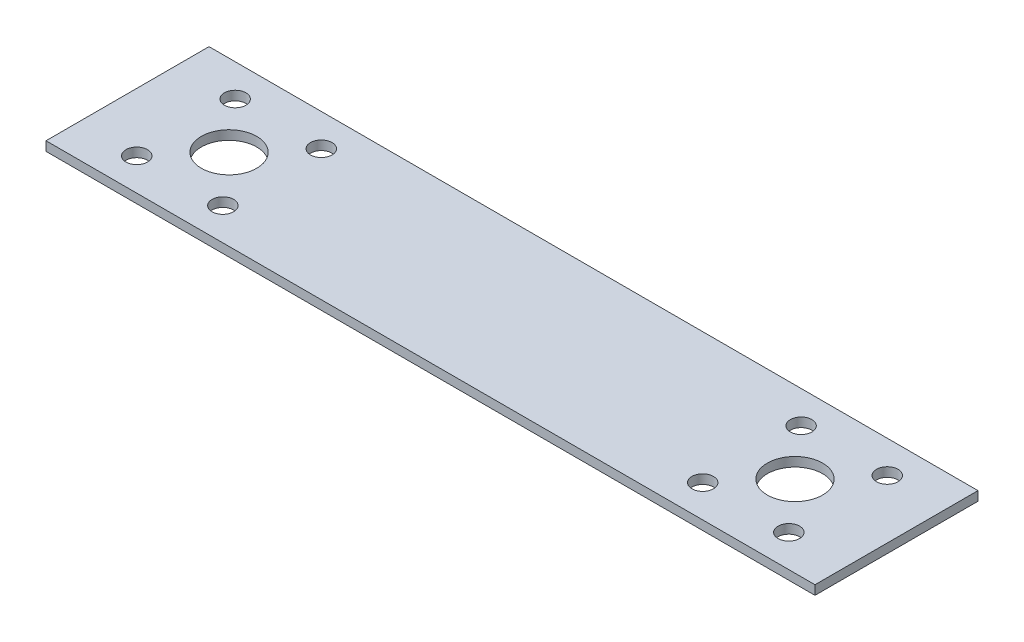
ISO-10303-21;
HEADER;
FILE_DESCRIPTION(('STEP AP214'),'2;1');
FILE_NAME('part.step','',(''),(''),'','','');
FILE_SCHEMA(('AUTOMOTIVE_DESIGN { 1 0 10303 214 1 1 1 1 }'));
ENDSEC;
DATA;
#1=APPLICATION_CONTEXT('core data for automotive mechanical design processes');
#2=APPLICATION_PROTOCOL_DEFINITION('international standard','automotive_design',2000,#1);
#3=PRODUCT_CONTEXT('',#1,'mechanical');
#4=PRODUCT('Part','Part','',(#3));
#5=PRODUCT_RELATED_PRODUCT_CATEGORY('part','',(#4));
#6=PRODUCT_DEFINITION_FORMATION('','',#4);
#7=PRODUCT_DEFINITION_CONTEXT('part definition',#1,'design');
#8=PRODUCT_DEFINITION('design','',#6,#7);
#9=PRODUCT_DEFINITION_SHAPE('','',#8);
#10=(LENGTH_UNIT() NAMED_UNIT(*) SI_UNIT(.MILLI.,.METRE.));
#11=(NAMED_UNIT(*) PLANE_ANGLE_UNIT() SI_UNIT($,.RADIAN.));
#12=(NAMED_UNIT(*) SI_UNIT($,.STERADIAN.) SOLID_ANGLE_UNIT());
#13=UNCERTAINTY_MEASURE_WITH_UNIT(LENGTH_MEASURE(1.E-05),#10,'distance_accuracy_value','');
#14=(GEOMETRIC_REPRESENTATION_CONTEXT(3) GLOBAL_UNCERTAINTY_ASSIGNED_CONTEXT((#13)) GLOBAL_UNIT_ASSIGNED_CONTEXT((#10,
#11,#12)) REPRESENTATION_CONTEXT('',''));
#15=CARTESIAN_POINT('',(0.,0.,0.));
#16=DIRECTION('',(0.,0.,1.));
#17=DIRECTION('',(1.,0.,0.));
#18=AXIS2_PLACEMENT_3D('',#15,#16,#17);
#19=CARTESIAN_POINT('',(0.,1.5,-24.4082974918942));
#20=DIRECTION('',(0.,0.,1.));
#21=DIRECTION('',(1.,0.,0.));
#22=AXIS2_PLACEMENT_3D('',#19,#20,#21);
#23=PLANE('',#22);
#24=DIRECTION('',(-1.,0.,0.));
#25=VECTOR('',#24,1.);
#26=CARTESIAN_POINT('',(0.,0.,-24.4082974918942));
#27=LINE('',#26,#25);
#28=CARTESIAN_POINT('',(61.8410162019103,0.,-24.4082974918942));
#29=VERTEX_POINT('',#28);
#30=CARTESIAN_POINT('',(-63.1589837980897,0.,-24.4082974918942));
#31=VERTEX_POINT('',#30);
#32=EDGE_CURVE('E154',#29,#31,#27,.T.);
#33=ORIENTED_EDGE('',*,*,#32,.F.);
#34=DIRECTION('',(0.,-1.,0.));
#35=VECTOR('',#34,1.);
#36=CARTESIAN_POINT('',(61.8410162019103,1.5,-24.4082974918942));
#37=LINE('',#36,#35);
#38=CARTESIAN_POINT('',(61.8410162019103,1.5,-24.4082974918942));
#39=VERTEX_POINT('',#38);
#40=EDGE_CURVE('E11',#39,#29,#37,.T.);
#41=ORIENTED_EDGE('',*,*,#40,.F.);
#42=DIRECTION('',(-1.,0.,0.));
#43=VECTOR('',#42,1.);
#44=CARTESIAN_POINT('',(0.,1.5,-24.4082974918942));
#45=LINE('',#44,#43);
#46=CARTESIAN_POINT('',(-63.1589837980897,1.5,-24.4082974918942));
#47=VERTEX_POINT('',#46);
#48=EDGE_CURVE('E95',#39,#47,#45,.T.);
#49=ORIENTED_EDGE('',*,*,#48,.T.);
#50=DIRECTION('',(0.,-1.,0.));
#51=VECTOR('',#50,1.);
#52=CARTESIAN_POINT('',(-63.1589837980897,1.5,-24.4082974918942));
#53=LINE('',#52,#51);
#54=EDGE_CURVE('E63',#47,#31,#53,.T.);
#55=ORIENTED_EDGE('',*,*,#54,.T.);
#56=EDGE_LOOP('',(#33,#41,#49,#55));
#57=FACE_BOUND('',#56,.T.);
#58=ADVANCED_FACE('F45',(#57),#23,.T.);
#59=CARTESIAN_POINT('',(61.8410162019103,1.5,0.));
#60=DIRECTION('',(-1.,0.,0.));
#61=DIRECTION('',(0.,0.,1.));
#62=AXIS2_PLACEMENT_3D('',#59,#60,#61);
#63=PLANE('',#62);
#64=DIRECTION('',(0.,0.,-1.));
#65=VECTOR('',#64,1.);
#66=CARTESIAN_POINT('',(61.8410162019103,0.,0.));
#67=LINE('',#66,#65);
#68=CARTESIAN_POINT('',(61.8410162019103,0.,-50.9082974918942));
#69=VERTEX_POINT('',#68);
#70=EDGE_CURVE('E102',#29,#69,#67,.T.);
#71=ORIENTED_EDGE('',*,*,#70,.T.);
#72=DIRECTION('',(0.,-1.,0.));
#73=VECTOR('',#72,1.);
#74=CARTESIAN_POINT('',(61.8410162019103,1.5,-50.9082974918942));
#75=LINE('',#74,#73);
#76=CARTESIAN_POINT('',(61.8410162019103,1.5,-50.9082974918942));
#77=VERTEX_POINT('',#76);
#78=EDGE_CURVE('E55',#77,#69,#75,.T.);
#79=ORIENTED_EDGE('',*,*,#78,.F.);
#80=DIRECTION('',(0.,0.,-1.));
#81=VECTOR('',#80,1.);
#82=CARTESIAN_POINT('',(61.8410162019103,1.5,0.));
#83=LINE('',#82,#81);
#84=EDGE_CURVE('E89',#39,#77,#83,.T.);
#85=ORIENTED_EDGE('',*,*,#84,.F.);
#86=ORIENTED_EDGE('',*,*,#40,.T.);
#87=EDGE_LOOP('',(#71,#79,#85,#86));
#88=FACE_BOUND('',#87,.T.);
#89=ADVANCED_FACE('F100',(#88),#63,.F.);
#90=CARTESIAN_POINT('',(0.,1.5,-50.9082974918942));
#91=DIRECTION('',(0.,0.,-1.));
#92=DIRECTION('',(-1.,0.,0.));
#93=AXIS2_PLACEMENT_3D('',#90,#91,#92);
#94=PLANE('',#93);
#95=DIRECTION('',(1.,0.,0.));
#96=VECTOR('',#95,1.);
#97=CARTESIAN_POINT('',(0.,0.,-50.9082974918942));
#98=LINE('',#97,#96);
#99=CARTESIAN_POINT('',(-63.1589837980897,0.,-50.9082974918942));
#100=VERTEX_POINT('',#99);
#101=EDGE_CURVE('E159',#100,#69,#98,.T.);
#102=ORIENTED_EDGE('',*,*,#101,.F.);
#103=DIRECTION('',(0.,-1.,0.));
#104=VECTOR('',#103,1.);
#105=CARTESIAN_POINT('',(-63.1589837980897,1.5,-50.9082974918942));
#106=LINE('',#105,#104);
#107=CARTESIAN_POINT('',(-63.1589837980897,1.5,-50.9082974918942));
#108=VERTEX_POINT('',#107);
#109=EDGE_CURVE('E76',#108,#100,#106,.T.);
#110=ORIENTED_EDGE('',*,*,#109,.F.);
#111=DIRECTION('',(1.,0.,0.));
#112=VECTOR('',#111,1.);
#113=CARTESIAN_POINT('',(0.,1.5,-50.9082974918942));
#114=LINE('',#113,#112);
#115=EDGE_CURVE('E94',#108,#77,#114,.T.);
#116=ORIENTED_EDGE('',*,*,#115,.T.);
#117=ORIENTED_EDGE('',*,*,#78,.T.);
#118=EDGE_LOOP('',(#102,#110,#116,#117));
#119=FACE_BOUND('',#118,.T.);
#120=ADVANCED_FACE('F106',(#119),#94,.T.);
#121=CARTESIAN_POINT('',(-46.6589837980897,1.5,-37.6582974918942));
#122=DIRECTION('',(0.,-1.,0.));
#123=DIRECTION('',(0.,0.,-1.));
#124=AXIS2_PLACEMENT_3D('',#121,#122,#123);
#125=CYLINDRICAL_SURFACE('',#124,4.5);
#126=CARTESIAN_POINT('',(-46.6589837980897,1.5,-37.6582974918942));
#127=DIRECTION('',(0.,1.,0.));
#128=DIRECTION('',(0.,0.,1.));
#129=AXIS2_PLACEMENT_3D('',#126,#127,#128);
#130=CIRCLE('',#129,4.5);
#131=CARTESIAN_POINT('',(-46.6589837980897,1.5,-33.1582974918942));
#132=VERTEX_POINT('',#131);
#133=EDGE_CURVE('E209',#132,#132,#130,.T.);
#134=ORIENTED_EDGE('',*,*,#133,.T.);
#135=EDGE_LOOP('',(#134));
#136=FACE_BOUND('',#135,.T.);
#137=CARTESIAN_POINT('',(-46.6589837980897,0.,-37.6582974918942));
#138=DIRECTION('',(0.,1.,0.));
#139=DIRECTION('',(0.,0.,1.));
#140=AXIS2_PLACEMENT_3D('',#137,#138,#139);
#141=CIRCLE('',#140,4.5);
#142=CARTESIAN_POINT('',(-46.6589837980897,0.,-33.1582974918942));
#143=VERTEX_POINT('',#142);
#144=EDGE_CURVE('E150',#143,#143,#141,.T.);
#145=ORIENTED_EDGE('',*,*,#144,.F.);
#146=EDGE_LOOP('',(#145));
#147=FACE_BOUND('',#146,.T.);
#148=ADVANCED_FACE('F233',(#136,#147),#125,.F.);
#149=CARTESIAN_POINT('',(-39.6589837980897,1.5,-45.6582974918942));
#150=DIRECTION('',(0.,-1.,0.));
#151=DIRECTION('',(0.,0.,-1.));
#152=AXIS2_PLACEMENT_3D('',#149,#150,#151);
#153=CYLINDRICAL_SURFACE('',#152,1.75);
#154=CARTESIAN_POINT('',(-39.6589837980897,1.5,-45.6582974918942));
#155=DIRECTION('',(0.,1.,0.));
#156=DIRECTION('',(0.,0.,1.));
#157=AXIS2_PLACEMENT_3D('',#154,#155,#156);
#158=CIRCLE('',#157,1.75);
#159=CARTESIAN_POINT('',(-39.6589837980897,1.5,-43.9082974918942));
#160=VERTEX_POINT('',#159);
#161=EDGE_CURVE('E205',#160,#160,#158,.T.);
#162=ORIENTED_EDGE('',*,*,#161,.T.);
#163=EDGE_LOOP('',(#162));
#164=FACE_BOUND('',#163,.T.);
#165=CARTESIAN_POINT('',(-39.6589837980897,0.,-45.6582974918942));
#166=DIRECTION('',(0.,1.,0.));
#167=DIRECTION('',(0.,0.,1.));
#168=AXIS2_PLACEMENT_3D('',#165,#166,#167);
#169=CIRCLE('',#168,1.75);
#170=CARTESIAN_POINT('',(-39.6589837980897,0.,-43.9082974918942));
#171=VERTEX_POINT('',#170);
#172=EDGE_CURVE('E146',#171,#171,#169,.T.);
#173=ORIENTED_EDGE('',*,*,#172,.F.);
#174=EDGE_LOOP('',(#173));
#175=FACE_BOUND('',#174,.T.);
#176=ADVANCED_FACE('F236',(#164,#175),#153,.F.);
#177=CARTESIAN_POINT('',(-39.6589837980897,1.5,-29.6582974918942));
#178=DIRECTION('',(0.,-1.,0.));
#179=DIRECTION('',(0.,0.,-1.));
#180=AXIS2_PLACEMENT_3D('',#177,#178,#179);
#181=CYLINDRICAL_SURFACE('',#180,1.75);
#182=CARTESIAN_POINT('',(-39.6589837980897,1.5,-29.6582974918942));
#183=DIRECTION('',(0.,1.,0.));
#184=DIRECTION('',(0.,0.,1.));
#185=AXIS2_PLACEMENT_3D('',#182,#183,#184);
#186=CIRCLE('',#185,1.75);
#187=CARTESIAN_POINT('',(-39.6589837980897,1.5,-27.9082974918942));
#188=VERTEX_POINT('',#187);
#189=EDGE_CURVE('E201',#188,#188,#186,.T.);
#190=ORIENTED_EDGE('',*,*,#189,.T.);
#191=EDGE_LOOP('',(#190));
#192=FACE_BOUND('',#191,.T.);
#193=CARTESIAN_POINT('',(-39.6589837980897,0.,-29.6582974918942));
#194=DIRECTION('',(0.,1.,0.));
#195=DIRECTION('',(0.,0.,1.));
#196=AXIS2_PLACEMENT_3D('',#193,#194,#195);
#197=CIRCLE('',#196,1.75);
#198=CARTESIAN_POINT('',(-39.6589837980897,0.,-27.9082974918942));
#199=VERTEX_POINT('',#198);
#200=EDGE_CURVE('E142',#199,#199,#197,.T.);
#201=ORIENTED_EDGE('',*,*,#200,.F.);
#202=EDGE_LOOP('',(#201));
#203=FACE_BOUND('',#202,.T.);
#204=ADVANCED_FACE('F240',(#192,#203),#181,.F.);
#205=CARTESIAN_POINT('',(-53.6589837980897,1.5,-29.6582974918942));
#206=DIRECTION('',(0.,-1.,0.));
#207=DIRECTION('',(0.,0.,-1.));
#208=AXIS2_PLACEMENT_3D('',#205,#206,#207);
#209=CYLINDRICAL_SURFACE('',#208,1.75);
#210=CARTESIAN_POINT('',(-53.6589837980897,1.5,-29.6582974918942));
#211=DIRECTION('',(0.,1.,0.));
#212=DIRECTION('',(0.,0.,1.));
#213=AXIS2_PLACEMENT_3D('',#210,#211,#212);
#214=CIRCLE('',#213,1.75);
#215=CARTESIAN_POINT('',(-53.6589837980897,1.5,-27.9082974918942));
#216=VERTEX_POINT('',#215);
#217=EDGE_CURVE('E197',#216,#216,#214,.T.);
#218=ORIENTED_EDGE('',*,*,#217,.T.);
#219=EDGE_LOOP('',(#218));
#220=FACE_BOUND('',#219,.T.);
#221=CARTESIAN_POINT('',(-53.6589837980897,0.,-29.6582974918942));
#222=DIRECTION('',(0.,1.,0.));
#223=DIRECTION('',(0.,0.,1.));
#224=AXIS2_PLACEMENT_3D('',#221,#222,#223);
#225=CIRCLE('',#224,1.75);
#226=CARTESIAN_POINT('',(-53.6589837980897,0.,-27.9082974918942));
#227=VERTEX_POINT('',#226);
#228=EDGE_CURVE('E138',#227,#227,#225,.T.);
#229=ORIENTED_EDGE('',*,*,#228,.F.);
#230=EDGE_LOOP('',(#229));
#231=FACE_BOUND('',#230,.T.);
#232=ADVANCED_FACE('F244',(#220,#231),#209,.F.);
#233=CARTESIAN_POINT('',(-53.6589837980897,1.5,-45.6582974918942));
#234=DIRECTION('',(0.,-1.,0.));
#235=DIRECTION('',(0.,0.,-1.));
#236=AXIS2_PLACEMENT_3D('',#233,#234,#235);
#237=CYLINDRICAL_SURFACE('',#236,1.75);
#238=CARTESIAN_POINT('',(-53.6589837980897,1.5,-45.6582974918942));
#239=DIRECTION('',(0.,1.,0.));
#240=DIRECTION('',(0.,0.,1.));
#241=AXIS2_PLACEMENT_3D('',#238,#239,#240);
#242=CIRCLE('',#241,1.75);
#243=CARTESIAN_POINT('',(-53.6589837980897,1.5,-43.9082974918942));
#244=VERTEX_POINT('',#243);
#245=EDGE_CURVE('E193',#244,#244,#242,.T.);
#246=ORIENTED_EDGE('',*,*,#245,.T.);
#247=EDGE_LOOP('',(#246));
#248=FACE_BOUND('',#247,.T.);
#249=CARTESIAN_POINT('',(-53.6589837980897,0.,-45.6582974918942));
#250=DIRECTION('',(0.,1.,0.));
#251=DIRECTION('',(0.,0.,1.));
#252=AXIS2_PLACEMENT_3D('',#249,#250,#251);
#253=CIRCLE('',#252,1.75);
#254=CARTESIAN_POINT('',(-53.6589837980897,0.,-43.9082974918942));
#255=VERTEX_POINT('',#254);
#256=EDGE_CURVE('E134',#255,#255,#253,.T.);
#257=ORIENTED_EDGE('',*,*,#256,.F.);
#258=EDGE_LOOP('',(#257));
#259=FACE_BOUND('',#258,.T.);
#260=ADVANCED_FACE('F248',(#248,#259),#237,.F.);
#261=CARTESIAN_POINT('',(45.3410162019103,1.5,-37.6582974918942));
#262=DIRECTION('',(0.,-1.,0.));
#263=DIRECTION('',(0.,0.,-1.));
#264=AXIS2_PLACEMENT_3D('',#261,#262,#263);
#265=CYLINDRICAL_SURFACE('',#264,4.5);
#266=CARTESIAN_POINT('',(45.3410162019103,1.5,-37.6582974918942));
#267=DIRECTION('',(0.,1.,0.));
#268=DIRECTION('',(0.,0.,1.));
#269=AXIS2_PLACEMENT_3D('',#266,#267,#268);
#270=CIRCLE('',#269,4.5);
#271=CARTESIAN_POINT('',(45.3410162019103,1.5,-33.1582974918942));
#272=VERTEX_POINT('',#271);
#273=EDGE_CURVE('E189',#272,#272,#270,.T.);
#274=ORIENTED_EDGE('',*,*,#273,.T.);
#275=EDGE_LOOP('',(#274));
#276=FACE_BOUND('',#275,.T.);
#277=CARTESIAN_POINT('',(45.3410162019103,0.,-37.6582974918942));
#278=DIRECTION('',(0.,1.,0.));
#279=DIRECTION('',(0.,0.,1.));
#280=AXIS2_PLACEMENT_3D('',#277,#278,#279);
#281=CIRCLE('',#280,4.5);
#282=CARTESIAN_POINT('',(45.3410162019103,0.,-33.1582974918942));
#283=VERTEX_POINT('',#282);
#284=EDGE_CURVE('E130',#283,#283,#281,.T.);
#285=ORIENTED_EDGE('',*,*,#284,.F.);
#286=EDGE_LOOP('',(#285));
#287=FACE_BOUND('',#286,.T.);
#288=ADVANCED_FACE('F252',(#276,#287),#265,.F.);
#289=CARTESIAN_POINT('',(52.3410162019103,1.5,-45.6582974918942));
#290=DIRECTION('',(0.,-1.,0.));
#291=DIRECTION('',(0.,0.,-1.));
#292=AXIS2_PLACEMENT_3D('',#289,#290,#291);
#293=CYLINDRICAL_SURFACE('',#292,1.75);
#294=CARTESIAN_POINT('',(52.3410162019103,1.5,-45.6582974918942));
#295=DIRECTION('',(0.,1.,0.));
#296=DIRECTION('',(0.,0.,1.));
#297=AXIS2_PLACEMENT_3D('',#294,#295,#296);
#298=CIRCLE('',#297,1.75);
#299=CARTESIAN_POINT('',(52.3410162019103,1.5,-43.9082974918942));
#300=VERTEX_POINT('',#299);
#301=EDGE_CURVE('E185',#300,#300,#298,.T.);
#302=ORIENTED_EDGE('',*,*,#301,.T.);
#303=EDGE_LOOP('',(#302));
#304=FACE_BOUND('',#303,.T.);
#305=CARTESIAN_POINT('',(52.3410162019103,0.,-45.6582974918942));
#306=DIRECTION('',(0.,1.,0.));
#307=DIRECTION('',(0.,0.,1.));
#308=AXIS2_PLACEMENT_3D('',#305,#306,#307);
#309=CIRCLE('',#308,1.75);
#310=CARTESIAN_POINT('',(52.3410162019103,0.,-43.9082974918942));
#311=VERTEX_POINT('',#310);
#312=EDGE_CURVE('E126',#311,#311,#309,.T.);
#313=ORIENTED_EDGE('',*,*,#312,.F.);
#314=EDGE_LOOP('',(#313));
#315=FACE_BOUND('',#314,.T.);
#316=ADVANCED_FACE('F256',(#304,#315),#293,.F.);
#317=CARTESIAN_POINT('',(52.3410162019103,1.5,-29.6582974918942));
#318=DIRECTION('',(0.,-1.,0.));
#319=DIRECTION('',(0.,0.,-1.));
#320=AXIS2_PLACEMENT_3D('',#317,#318,#319);
#321=CYLINDRICAL_SURFACE('',#320,1.75);
#322=CARTESIAN_POINT('',(52.3410162019103,1.5,-29.6582974918942));
#323=DIRECTION('',(0.,1.,0.));
#324=DIRECTION('',(0.,0.,1.));
#325=AXIS2_PLACEMENT_3D('',#322,#323,#324);
#326=CIRCLE('',#325,1.75);
#327=CARTESIAN_POINT('',(52.3410162019103,1.5,-27.9082974918942));
#328=VERTEX_POINT('',#327);
#329=EDGE_CURVE('E179',#328,#328,#326,.T.);
#330=ORIENTED_EDGE('',*,*,#329,.T.);
#331=EDGE_LOOP('',(#330));
#332=FACE_BOUND('',#331,.T.);
#333=CARTESIAN_POINT('',(52.3410162019103,0.,-29.6582974918942));
#334=DIRECTION('',(0.,1.,0.));
#335=DIRECTION('',(0.,0.,1.));
#336=AXIS2_PLACEMENT_3D('',#333,#334,#335);
#337=CIRCLE('',#336,1.75);
#338=CARTESIAN_POINT('',(52.3410162019103,0.,-27.9082974918942));
#339=VERTEX_POINT('',#338);
#340=EDGE_CURVE('E122',#339,#339,#337,.T.);
#341=ORIENTED_EDGE('',*,*,#340,.F.);
#342=EDGE_LOOP('',(#341));
#343=FACE_BOUND('',#342,.T.);
#344=ADVANCED_FACE('F260',(#332,#343),#321,.F.);
#345=CARTESIAN_POINT('',(38.3410162019103,1.5,-45.6582974918942));
#346=DIRECTION('',(0.,-1.,0.));
#347=DIRECTION('',(0.,0.,-1.));
#348=AXIS2_PLACEMENT_3D('',#345,#346,#347);
#349=CYLINDRICAL_SURFACE('',#348,1.75);
#350=CARTESIAN_POINT('',(38.3410162019103,1.5,-45.6582974918942));
#351=DIRECTION('',(0.,1.,0.));
#352=DIRECTION('',(0.,0.,1.));
#353=AXIS2_PLACEMENT_3D('',#350,#351,#352);
#354=CIRCLE('',#353,1.75);
#355=CARTESIAN_POINT('',(38.3410162019103,1.5,-43.9082974918942));
#356=VERTEX_POINT('',#355);
#357=EDGE_CURVE('E173',#356,#356,#354,.T.);
#358=ORIENTED_EDGE('',*,*,#357,.T.);
#359=EDGE_LOOP('',(#358));
#360=FACE_BOUND('',#359,.T.);
#361=CARTESIAN_POINT('',(38.3410162019103,0.,-45.6582974918942));
#362=DIRECTION('',(0.,1.,0.));
#363=DIRECTION('',(0.,0.,1.));
#364=AXIS2_PLACEMENT_3D('',#361,#362,#363);
#365=CIRCLE('',#364,1.75);
#366=CARTESIAN_POINT('',(38.3410162019103,0.,-43.9082974918942));
#367=VERTEX_POINT('',#366);
#368=EDGE_CURVE('E118',#367,#367,#365,.T.);
#369=ORIENTED_EDGE('',*,*,#368,.F.);
#370=EDGE_LOOP('',(#369));
#371=FACE_BOUND('',#370,.T.);
#372=ADVANCED_FACE('F223',(#360,#371),#349,.F.);
#373=CARTESIAN_POINT('',(38.3410162019103,1.5,-29.6582974918942));
#374=DIRECTION('',(0.,-1.,0.));
#375=DIRECTION('',(0.,0.,-1.));
#376=AXIS2_PLACEMENT_3D('',#373,#374,#375);
#377=CYLINDRICAL_SURFACE('',#376,1.75);
#378=CARTESIAN_POINT('',(38.3410162019103,1.5,-29.6582974918942));
#379=DIRECTION('',(0.,1.,0.));
#380=DIRECTION('',(0.,0.,1.));
#381=AXIS2_PLACEMENT_3D('',#378,#379,#380);
#382=CIRCLE('',#381,1.75);
#383=CARTESIAN_POINT('',(38.3410162019103,1.5,-27.9082974918942));
#384=VERTEX_POINT('',#383);
#385=EDGE_CURVE('E166',#384,#384,#382,.T.);
#386=ORIENTED_EDGE('',*,*,#385,.T.);
#387=EDGE_LOOP('',(#386));
#388=FACE_BOUND('',#387,.T.);
#389=CARTESIAN_POINT('',(38.3410162019103,0.,-29.6582974918942));
#390=DIRECTION('',(0.,1.,0.));
#391=DIRECTION('',(0.,0.,1.));
#392=AXIS2_PLACEMENT_3D('',#389,#390,#391);
#393=CIRCLE('',#392,1.75);
#394=CARTESIAN_POINT('',(38.3410162019103,0.,-27.9082974918942));
#395=VERTEX_POINT('',#394);
#396=EDGE_CURVE('E114',#395,#395,#393,.T.);
#397=ORIENTED_EDGE('',*,*,#396,.F.);
#398=EDGE_LOOP('',(#397));
#399=FACE_BOUND('',#398,.T.);
#400=ADVANCED_FACE('F47',(#388,#399),#377,.F.);
#401=CARTESIAN_POINT('',(-63.1589837980897,1.5,0.));
#402=DIRECTION('',(-1.,0.,0.));
#403=DIRECTION('',(0.,0.,1.));
#404=AXIS2_PLACEMENT_3D('',#401,#402,#403);
#405=PLANE('',#404);
#406=DIRECTION('',(0.,0.,-1.));
#407=VECTOR('',#406,1.);
#408=CARTESIAN_POINT('',(-63.1589837980897,0.,0.));
#409=LINE('',#408,#407);
#410=EDGE_CURVE('E162',#31,#100,#409,.T.);
#411=ORIENTED_EDGE('',*,*,#410,.F.);
#412=ORIENTED_EDGE('',*,*,#54,.F.);
#413=DIRECTION('',(0.,0.,-1.));
#414=VECTOR('',#413,1.);
#415=CARTESIAN_POINT('',(-63.1589837980897,1.5,0.));
#416=LINE('',#415,#414);
#417=EDGE_CURVE('E108',#47,#108,#416,.T.);
#418=ORIENTED_EDGE('',*,*,#417,.T.);
#419=ORIENTED_EDGE('',*,*,#109,.T.);
#420=EDGE_LOOP('',(#411,#412,#418,#419));
#421=FACE_BOUND('',#420,.T.);
#422=ADVANCED_FACE('F213',(#421),#405,.T.);
#423=CARTESIAN_POINT('',(0.,1.5,0.));
#424=DIRECTION('',(0.,1.,0.));
#425=DIRECTION('',(0.,0.,1.));
#426=AXIS2_PLACEMENT_3D('',#423,#424,#425);
#427=PLANE('',#426);
#428=ORIENTED_EDGE('',*,*,#385,.F.);
#429=EDGE_LOOP('',(#428));
#430=FACE_BOUND('',#429,.T.);
#431=ORIENTED_EDGE('',*,*,#357,.F.);
#432=EDGE_LOOP('',(#431));
#433=FACE_BOUND('',#432,.T.);
#434=ORIENTED_EDGE('',*,*,#329,.F.);
#435=EDGE_LOOP('',(#434));
#436=FACE_BOUND('',#435,.T.);
#437=ORIENTED_EDGE('',*,*,#301,.F.);
#438=EDGE_LOOP('',(#437));
#439=FACE_BOUND('',#438,.T.);
#440=ORIENTED_EDGE('',*,*,#273,.F.);
#441=EDGE_LOOP('',(#440));
#442=FACE_BOUND('',#441,.T.);
#443=ORIENTED_EDGE('',*,*,#245,.F.);
#444=EDGE_LOOP('',(#443));
#445=FACE_BOUND('',#444,.T.);
#446=ORIENTED_EDGE('',*,*,#217,.F.);
#447=EDGE_LOOP('',(#446));
#448=FACE_BOUND('',#447,.T.);
#449=ORIENTED_EDGE('',*,*,#189,.F.);
#450=EDGE_LOOP('',(#449));
#451=FACE_BOUND('',#450,.T.);
#452=ORIENTED_EDGE('',*,*,#161,.F.);
#453=EDGE_LOOP('',(#452));
#454=FACE_BOUND('',#453,.T.);
#455=ORIENTED_EDGE('',*,*,#133,.F.);
#456=EDGE_LOOP('',(#455));
#457=FACE_BOUND('',#456,.T.);
#458=ORIENTED_EDGE('',*,*,#48,.F.);
#459=ORIENTED_EDGE('',*,*,#84,.T.);
#460=ORIENTED_EDGE('',*,*,#115,.F.);
#461=ORIENTED_EDGE('',*,*,#417,.F.);
#462=EDGE_LOOP('',(#458,#459,#460,#461));
#463=FACE_BOUND('',#462,.T.);
#464=ADVANCED_FACE('F91',(#430,#433,#436,#439,#442,#445,#448,#451,#454,#457,#463),#427,.T.);
#465=CARTESIAN_POINT('',(0.,0.,0.));
#466=DIRECTION('',(0.,1.,0.));
#467=DIRECTION('',(0.,0.,1.));
#468=AXIS2_PLACEMENT_3D('',#465,#466,#467);
#469=PLANE('',#468);
#470=ORIENTED_EDGE('',*,*,#396,.T.);
#471=EDGE_LOOP('',(#470));
#472=FACE_BOUND('',#471,.T.);
#473=ORIENTED_EDGE('',*,*,#368,.T.);
#474=EDGE_LOOP('',(#473));
#475=FACE_BOUND('',#474,.T.);
#476=ORIENTED_EDGE('',*,*,#340,.T.);
#477=EDGE_LOOP('',(#476));
#478=FACE_BOUND('',#477,.T.);
#479=ORIENTED_EDGE('',*,*,#312,.T.);
#480=EDGE_LOOP('',(#479));
#481=FACE_BOUND('',#480,.T.);
#482=ORIENTED_EDGE('',*,*,#284,.T.);
#483=EDGE_LOOP('',(#482));
#484=FACE_BOUND('',#483,.T.);
#485=ORIENTED_EDGE('',*,*,#256,.T.);
#486=EDGE_LOOP('',(#485));
#487=FACE_BOUND('',#486,.T.);
#488=ORIENTED_EDGE('',*,*,#228,.T.);
#489=EDGE_LOOP('',(#488));
#490=FACE_BOUND('',#489,.T.);
#491=ORIENTED_EDGE('',*,*,#200,.T.);
#492=EDGE_LOOP('',(#491));
#493=FACE_BOUND('',#492,.T.);
#494=ORIENTED_EDGE('',*,*,#172,.T.);
#495=EDGE_LOOP('',(#494));
#496=FACE_BOUND('',#495,.T.);
#497=ORIENTED_EDGE('',*,*,#144,.T.);
#498=EDGE_LOOP('',(#497));
#499=FACE_BOUND('',#498,.T.);
#500=ORIENTED_EDGE('',*,*,#32,.T.);
#501=ORIENTED_EDGE('',*,*,#410,.T.);
#502=ORIENTED_EDGE('',*,*,#101,.T.);
#503=ORIENTED_EDGE('',*,*,#70,.F.);
#504=EDGE_LOOP('',(#500,#501,#502,#503));
#505=FACE_BOUND('',#504,.T.);
#506=ADVANCED_FACE('F220',(#472,#475,#478,#481,#484,#487,#490,#493,#496,#499,#505),#469,.F.);
#507=CLOSED_SHELL('',(#58,#89,#120,#148,#176,#204,#232,#260,#288,#316,#344,#372,#400,#422,#464,#506));
#508=MANIFOLD_SOLID_BREP('B2',#507);
#509=ADVANCED_BREP_SHAPE_REPRESENTATION('',(#18,#508),#14);
#510=SHAPE_DEFINITION_REPRESENTATION(#9,#509);
ENDSEC;
END-ISO-10303-21;
